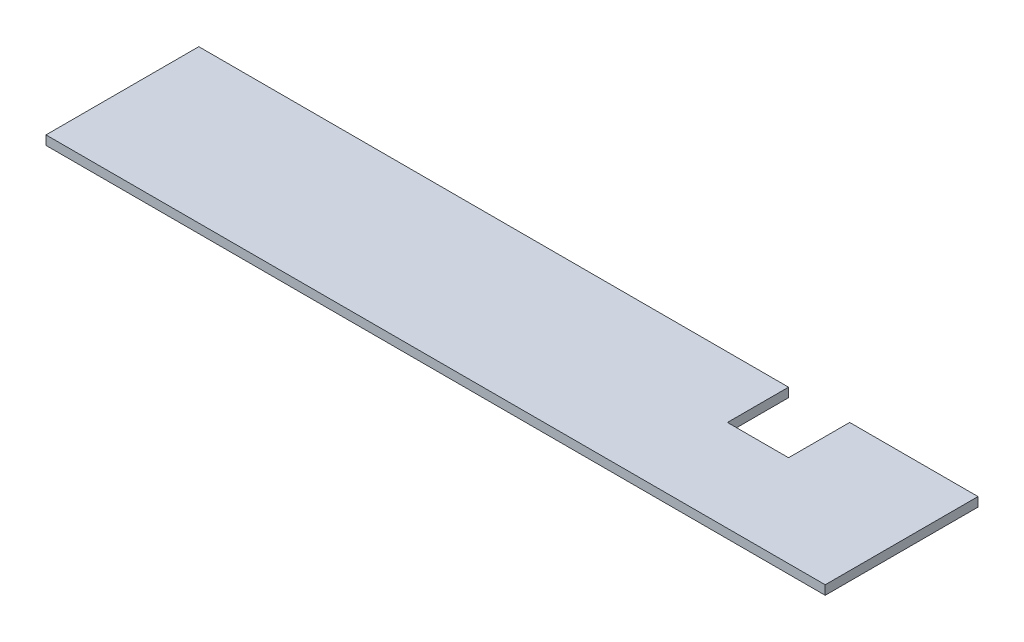
ISO-10303-21;
HEADER;
FILE_DESCRIPTION(('STEP AP214'),'2;1');
FILE_NAME('part.step','',(''),(''),'','','');
FILE_SCHEMA(('AUTOMOTIVE_DESIGN { 1 0 10303 214 1 1 1 1 }'));
ENDSEC;
DATA;
#1=APPLICATION_CONTEXT('core data for automotive mechanical design processes');
#2=APPLICATION_PROTOCOL_DEFINITION('international standard','automotive_design',2000,#1);
#3=PRODUCT_CONTEXT('',#1,'mechanical');
#4=PRODUCT('Part','Part','',(#3));
#5=PRODUCT_RELATED_PRODUCT_CATEGORY('part','',(#4));
#6=PRODUCT_DEFINITION_FORMATION('','',#4);
#7=PRODUCT_DEFINITION_CONTEXT('part definition',#1,'design');
#8=PRODUCT_DEFINITION('design','',#6,#7);
#9=PRODUCT_DEFINITION_SHAPE('','',#8);
#10=(LENGTH_UNIT() NAMED_UNIT(*) SI_UNIT(.MILLI.,.METRE.));
#11=(NAMED_UNIT(*) PLANE_ANGLE_UNIT() SI_UNIT($,.RADIAN.));
#12=(NAMED_UNIT(*) SI_UNIT($,.STERADIAN.) SOLID_ANGLE_UNIT());
#13=UNCERTAINTY_MEASURE_WITH_UNIT(LENGTH_MEASURE(1.E-05),#10,'distance_accuracy_value','');
#14=(GEOMETRIC_REPRESENTATION_CONTEXT(3) GLOBAL_UNCERTAINTY_ASSIGNED_CONTEXT((#13)) GLOBAL_UNIT_ASSIGNED_CONTEXT((#10,
#11,#12)) REPRESENTATION_CONTEXT('',''));
#15=CARTESIAN_POINT('',(0.,0.,0.));
#16=DIRECTION('',(0.,0.,1.));
#17=DIRECTION('',(1.,0.,0.));
#18=AXIS2_PLACEMENT_3D('',#15,#16,#17);
#19=CARTESIAN_POINT('',(-42.0467804095657,3.,-23.5166774564098));
#20=DIRECTION('',(0.,0.,1.));
#21=DIRECTION('',(1.,0.,0.));
#22=AXIS2_PLACEMENT_3D('',#19,#20,#21);
#23=PLANE('',#22);
#24=DIRECTION('',(-1.,0.,0.));
#25=VECTOR('',#24,1.);
#26=CARTESIAN_POINT('',(-42.0467804095657,0.,-23.5166774564098));
#27=LINE('',#26,#25);
#28=CARTESIAN_POINT('',(212.953219590434,0.,-23.5166774564098));
#29=VERTEX_POINT('',#28);
#30=CARTESIAN_POINT('',(170.953219590434,0.,-23.5166774564098));
#31=VERTEX_POINT('',#30);
#32=EDGE_CURVE('E126',#29,#31,#27,.T.);
#33=ORIENTED_EDGE('',*,*,#32,.T.);
#34=DIRECTION('',(0.,1.,0.));
#35=VECTOR('',#34,1.);
#36=CARTESIAN_POINT('',(170.953219590434,0.,-23.5166774564098));
#37=LINE('',#36,#35);
#38=CARTESIAN_POINT('',(170.953219590434,3.,-23.5166774564098));
#39=VERTEX_POINT('',#38);
#40=EDGE_CURVE('E110',#31,#39,#37,.T.);
#41=ORIENTED_EDGE('',*,*,#40,.T.);
#42=DIRECTION('',(-1.,0.,0.));
#43=VECTOR('',#42,1.);
#44=CARTESIAN_POINT('',(-42.0467804095657,3.,-23.5166774564098));
#45=LINE('',#44,#43);
#46=CARTESIAN_POINT('',(212.953219590434,3.,-23.5166774564098));
#47=VERTEX_POINT('',#46);
#48=EDGE_CURVE('E143',#47,#39,#45,.T.);
#49=ORIENTED_EDGE('',*,*,#48,.F.);
#50=DIRECTION('',(0.,-1.,0.));
#51=VECTOR('',#50,1.);
#52=CARTESIAN_POINT('',(212.953219590434,3.,-23.5166774564098));
#53=LINE('',#52,#51);
#54=EDGE_CURVE('E133',#47,#29,#53,.T.);
#55=ORIENTED_EDGE('',*,*,#54,.T.);
#56=EDGE_LOOP('',(#33,#41,#49,#55));
#57=FACE_BOUND('',#56,.T.);
#58=ADVANCED_FACE('F35',(#57),#23,.F.);
#59=CARTESIAN_POINT('',(-42.0467804095657,3.,-23.5166774564098));
#60=DIRECTION('',(1.,0.,0.));
#61=DIRECTION('',(0.,0.,-1.));
#62=AXIS2_PLACEMENT_3D('',#59,#60,#61);
#63=PLANE('',#62);
#64=DIRECTION('',(0.,0.,1.));
#65=VECTOR('',#64,1.);
#66=CARTESIAN_POINT('',(-42.0467804095657,0.,-23.5166774564098));
#67=LINE('',#66,#65);
#68=CARTESIAN_POINT('',(-42.0467804095657,0.,-23.5166774564098));
#69=VERTEX_POINT('',#68);
#70=CARTESIAN_POINT('',(-42.0467804095657,0.,26.4833225435902));
#71=VERTEX_POINT('',#70);
#72=EDGE_CURVE('E151',#69,#71,#67,.T.);
#73=ORIENTED_EDGE('',*,*,#72,.T.);
#74=DIRECTION('',(0.,-1.,0.));
#75=VECTOR('',#74,1.);
#76=CARTESIAN_POINT('',(-42.0467804095657,3.,26.4833225435902));
#77=LINE('',#76,#75);
#78=CARTESIAN_POINT('',(-42.0467804095657,3.,26.4833225435902));
#79=VERTEX_POINT('',#78);
#80=EDGE_CURVE('E11',#79,#71,#77,.T.);
#81=ORIENTED_EDGE('',*,*,#80,.F.);
#82=DIRECTION('',(0.,0.,1.));
#83=VECTOR('',#82,1.);
#84=CARTESIAN_POINT('',(-42.0467804095657,3.,-23.5166774564098));
#85=LINE('',#84,#83);
#86=CARTESIAN_POINT('',(-42.0467804095657,3.,-23.5166774564098));
#87=VERTEX_POINT('',#86);
#88=EDGE_CURVE('E134',#87,#79,#85,.T.);
#89=ORIENTED_EDGE('',*,*,#88,.F.);
#90=DIRECTION('',(0.,-1.,0.));
#91=VECTOR('',#90,1.);
#92=CARTESIAN_POINT('',(-42.0467804095657,3.,-23.5166774564098));
#93=LINE('',#92,#91);
#94=EDGE_CURVE('E141',#87,#69,#93,.T.);
#95=ORIENTED_EDGE('',*,*,#94,.T.);
#96=EDGE_LOOP('',(#73,#81,#89,#95));
#97=FACE_BOUND('',#96,.T.);
#98=ADVANCED_FACE('F37',(#97),#63,.F.);
#99=CARTESIAN_POINT('',(-42.0467804095657,3.,26.4833225435902));
#100=DIRECTION('',(0.,0.,-1.));
#101=DIRECTION('',(-1.,0.,0.));
#102=AXIS2_PLACEMENT_3D('',#99,#100,#101);
#103=PLANE('',#102);
#104=DIRECTION('',(1.,0.,0.));
#105=VECTOR('',#104,1.);
#106=CARTESIAN_POINT('',(-42.0467804095657,0.,26.4833225435902));
#107=LINE('',#106,#105);
#108=CARTESIAN_POINT('',(212.953219590434,0.,26.4833225435902));
#109=VERTEX_POINT('',#108);
#110=EDGE_CURVE('E150',#71,#109,#107,.T.);
#111=ORIENTED_EDGE('',*,*,#110,.T.);
#112=DIRECTION('',(0.,-1.,0.));
#113=VECTOR('',#112,1.);
#114=CARTESIAN_POINT('',(212.953219590434,3.,26.4833225435902));
#115=LINE('',#114,#113);
#116=CARTESIAN_POINT('',(212.953219590434,3.,26.4833225435902));
#117=VERTEX_POINT('',#116);
#118=EDGE_CURVE('E43',#117,#109,#115,.T.);
#119=ORIENTED_EDGE('',*,*,#118,.F.);
#120=DIRECTION('',(1.,0.,0.));
#121=VECTOR('',#120,1.);
#122=CARTESIAN_POINT('',(-42.0467804095657,3.,26.4833225435902));
#123=LINE('',#122,#121);
#124=EDGE_CURVE('E88',#79,#117,#123,.T.);
#125=ORIENTED_EDGE('',*,*,#124,.F.);
#126=ORIENTED_EDGE('',*,*,#80,.T.);
#127=EDGE_LOOP('',(#111,#119,#125,#126));
#128=FACE_BOUND('',#127,.T.);
#129=ADVANCED_FACE('F192',(#128),#103,.F.);
#130=CARTESIAN_POINT('',(212.953219590434,3.,-23.5166774564098));
#131=DIRECTION('',(-1.,0.,0.));
#132=DIRECTION('',(0.,0.,1.));
#133=AXIS2_PLACEMENT_3D('',#130,#131,#132);
#134=PLANE('',#133);
#135=DIRECTION('',(0.,0.,-1.));
#136=VECTOR('',#135,1.);
#137=CARTESIAN_POINT('',(212.953219590434,0.,-23.5166774564098));
#138=LINE('',#137,#136);
#139=EDGE_CURVE('E137',#109,#29,#138,.T.);
#140=ORIENTED_EDGE('',*,*,#139,.T.);
#141=ORIENTED_EDGE('',*,*,#54,.F.);
#142=DIRECTION('',(0.,0.,-1.));
#143=VECTOR('',#142,1.);
#144=CARTESIAN_POINT('',(212.953219590434,3.,-23.5166774564098));
#145=LINE('',#144,#143);
#146=EDGE_CURVE('E148',#117,#47,#145,.T.);
#147=ORIENTED_EDGE('',*,*,#146,.F.);
#148=ORIENTED_EDGE('',*,*,#118,.T.);
#149=EDGE_LOOP('',(#140,#141,#147,#148));
#150=FACE_BOUND('',#149,.T.);
#151=ADVANCED_FACE('F147',(#150),#134,.F.);
#152=CARTESIAN_POINT('',(150.953219590434,3.,-23.5166774564098));
#153=VERTEX_POINT('',#152);
#154=EDGE_CURVE('E59',#153,#87,#45,.T.);
#155=ORIENTED_EDGE('',*,*,#154,.F.);
#156=DIRECTION('',(0.,1.,0.));
#157=VECTOR('',#156,1.);
#158=CARTESIAN_POINT('',(150.953219590434,0.,-23.5166774564098));
#159=LINE('',#158,#157);
#160=CARTESIAN_POINT('',(150.953219590434,0.,-23.5166774564098));
#161=VERTEX_POINT('',#160);
#162=EDGE_CURVE('E120',#161,#153,#159,.T.);
#163=ORIENTED_EDGE('',*,*,#162,.F.);
#164=EDGE_CURVE('E81',#161,#69,#27,.T.);
#165=ORIENTED_EDGE('',*,*,#164,.T.);
#166=ORIENTED_EDGE('',*,*,#94,.F.);
#167=EDGE_LOOP('',(#155,#163,#165,#166));
#168=FACE_BOUND('',#167,.T.);
#169=ADVANCED_FACE('F172',(#168),#23,.F.);
#170=CARTESIAN_POINT('',(0.,3.,0.));
#171=DIRECTION('',(0.,1.,0.));
#172=DIRECTION('',(0.,0.,1.));
#173=AXIS2_PLACEMENT_3D('',#170,#171,#172);
#174=PLANE('',#173);
#175=DIRECTION('',(0.,0.,-1.));
#176=VECTOR('',#175,1.);
#177=CARTESIAN_POINT('',(170.953219590434,3.,-23.5166774564098));
#178=LINE('',#177,#176);
#179=CARTESIAN_POINT('',(170.953219590434,3.,-3.51667745640977));
#180=VERTEX_POINT('',#179);
#181=EDGE_CURVE('E115',#180,#39,#178,.T.);
#182=ORIENTED_EDGE('',*,*,#181,.F.);
#183=DIRECTION('',(1.,0.,0.));
#184=VECTOR('',#183,1.);
#185=CARTESIAN_POINT('',(170.953219590434,3.,-3.51667745640977));
#186=LINE('',#185,#184);
#187=CARTESIAN_POINT('',(150.953219590434,3.,-3.51667745640977));
#188=VERTEX_POINT('',#187);
#189=EDGE_CURVE('E129',#188,#180,#186,.T.);
#190=ORIENTED_EDGE('',*,*,#189,.F.);
#191=DIRECTION('',(0.,0.,1.));
#192=VECTOR('',#191,1.);
#193=CARTESIAN_POINT('',(150.953219590434,3.,-23.5166774564098));
#194=LINE('',#193,#192);
#195=EDGE_CURVE('E165',#153,#188,#194,.T.);
#196=ORIENTED_EDGE('',*,*,#195,.F.);
#197=ORIENTED_EDGE('',*,*,#154,.T.);
#198=ORIENTED_EDGE('',*,*,#88,.T.);
#199=ORIENTED_EDGE('',*,*,#124,.T.);
#200=ORIENTED_EDGE('',*,*,#146,.T.);
#201=ORIENTED_EDGE('',*,*,#48,.T.);
#202=EDGE_LOOP('',(#182,#190,#196,#197,#198,#199,#200,#201));
#203=FACE_BOUND('',#202,.T.);
#204=ADVANCED_FACE('F176',(#203),#174,.T.);
#205=CARTESIAN_POINT('',(0.,0.,0.));
#206=DIRECTION('',(0.,1.,0.));
#207=DIRECTION('',(0.,0.,1.));
#208=AXIS2_PLACEMENT_3D('',#205,#206,#207);
#209=PLANE('',#208);
#210=DIRECTION('',(1.,0.,0.));
#211=VECTOR('',#210,1.);
#212=CARTESIAN_POINT('',(170.953219590434,0.,-3.51667745640977));
#213=LINE('',#212,#211);
#214=CARTESIAN_POINT('',(150.953219590434,0.,-3.51667745640977));
#215=VERTEX_POINT('',#214);
#216=CARTESIAN_POINT('',(170.953219590434,0.,-3.51667745640977));
#217=VERTEX_POINT('',#216);
#218=EDGE_CURVE('E50',#215,#217,#213,.T.);
#219=ORIENTED_EDGE('',*,*,#218,.T.);
#220=DIRECTION('',(0.,0.,-1.));
#221=VECTOR('',#220,1.);
#222=CARTESIAN_POINT('',(170.953219590434,0.,-23.5166774564098));
#223=LINE('',#222,#221);
#224=EDGE_CURVE('E113',#217,#31,#223,.T.);
#225=ORIENTED_EDGE('',*,*,#224,.T.);
#226=ORIENTED_EDGE('',*,*,#32,.F.);
#227=ORIENTED_EDGE('',*,*,#139,.F.);
#228=ORIENTED_EDGE('',*,*,#110,.F.);
#229=ORIENTED_EDGE('',*,*,#72,.F.);
#230=ORIENTED_EDGE('',*,*,#164,.F.);
#231=DIRECTION('',(0.,0.,1.));
#232=VECTOR('',#231,1.);
#233=CARTESIAN_POINT('',(150.953219590434,0.,-23.5166774564098));
#234=LINE('',#233,#232);
#235=EDGE_CURVE('E128',#161,#215,#234,.T.);
#236=ORIENTED_EDGE('',*,*,#235,.T.);
#237=EDGE_LOOP('',(#219,#225,#226,#227,#228,#229,#230,#236));
#238=FACE_BOUND('',#237,.T.);
#239=ADVANCED_FACE('F124',(#238),#209,.F.);
#240=CARTESIAN_POINT('',(170.953219590434,0.,-23.5166774564098));
#241=DIRECTION('',(1.,0.,0.));
#242=DIRECTION('',(0.,0.,-1.));
#243=AXIS2_PLACEMENT_3D('',#240,#241,#242);
#244=PLANE('',#243);
#245=ORIENTED_EDGE('',*,*,#181,.T.);
#246=ORIENTED_EDGE('',*,*,#40,.F.);
#247=ORIENTED_EDGE('',*,*,#224,.F.);
#248=DIRECTION('',(0.,1.,0.));
#249=VECTOR('',#248,1.);
#250=CARTESIAN_POINT('',(170.953219590434,0.,-3.51667745640977));
#251=LINE('',#250,#249);
#252=EDGE_CURVE('E153',#217,#180,#251,.T.);
#253=ORIENTED_EDGE('',*,*,#252,.T.);
#254=EDGE_LOOP('',(#245,#246,#247,#253));
#255=FACE_BOUND('',#254,.T.);
#256=ADVANCED_FACE('F112',(#255),#244,.F.);
#257=CARTESIAN_POINT('',(170.953219590434,0.,-3.51667745640977));
#258=DIRECTION('',(0.,0.,1.));
#259=DIRECTION('',(1.,0.,0.));
#260=AXIS2_PLACEMENT_3D('',#257,#258,#259);
#261=PLANE('',#260);
#262=ORIENTED_EDGE('',*,*,#189,.T.);
#263=ORIENTED_EDGE('',*,*,#252,.F.);
#264=ORIENTED_EDGE('',*,*,#218,.F.);
#265=DIRECTION('',(0.,1.,0.));
#266=VECTOR('',#265,1.);
#267=CARTESIAN_POINT('',(150.953219590434,0.,-3.51667745640977));
#268=LINE('',#267,#266);
#269=EDGE_CURVE('E160',#215,#188,#268,.T.);
#270=ORIENTED_EDGE('',*,*,#269,.T.);
#271=EDGE_LOOP('',(#262,#263,#264,#270));
#272=FACE_BOUND('',#271,.T.);
#273=ADVANCED_FACE('F178',(#272),#261,.F.);
#274=CARTESIAN_POINT('',(150.953219590434,0.,-23.5166774564098));
#275=DIRECTION('',(-1.,0.,0.));
#276=DIRECTION('',(0.,0.,1.));
#277=AXIS2_PLACEMENT_3D('',#274,#275,#276);
#278=PLANE('',#277);
#279=ORIENTED_EDGE('',*,*,#195,.T.);
#280=ORIENTED_EDGE('',*,*,#269,.F.);
#281=ORIENTED_EDGE('',*,*,#235,.F.);
#282=ORIENTED_EDGE('',*,*,#162,.T.);
#283=EDGE_LOOP('',(#279,#280,#281,#282));
#284=FACE_BOUND('',#283,.T.);
#285=ADVANCED_FACE('F171',(#284),#278,.F.);
#286=CLOSED_SHELL('',(#58,#98,#129,#151,#169,#204,#239,#256,#273,#285));
#287=MANIFOLD_SOLID_BREP('B2',#286);
#288=ADVANCED_BREP_SHAPE_REPRESENTATION('',(#18,#287),#14);
#289=SHAPE_DEFINITION_REPRESENTATION(#9,#288);
ENDSEC;
END-ISO-10303-21;
